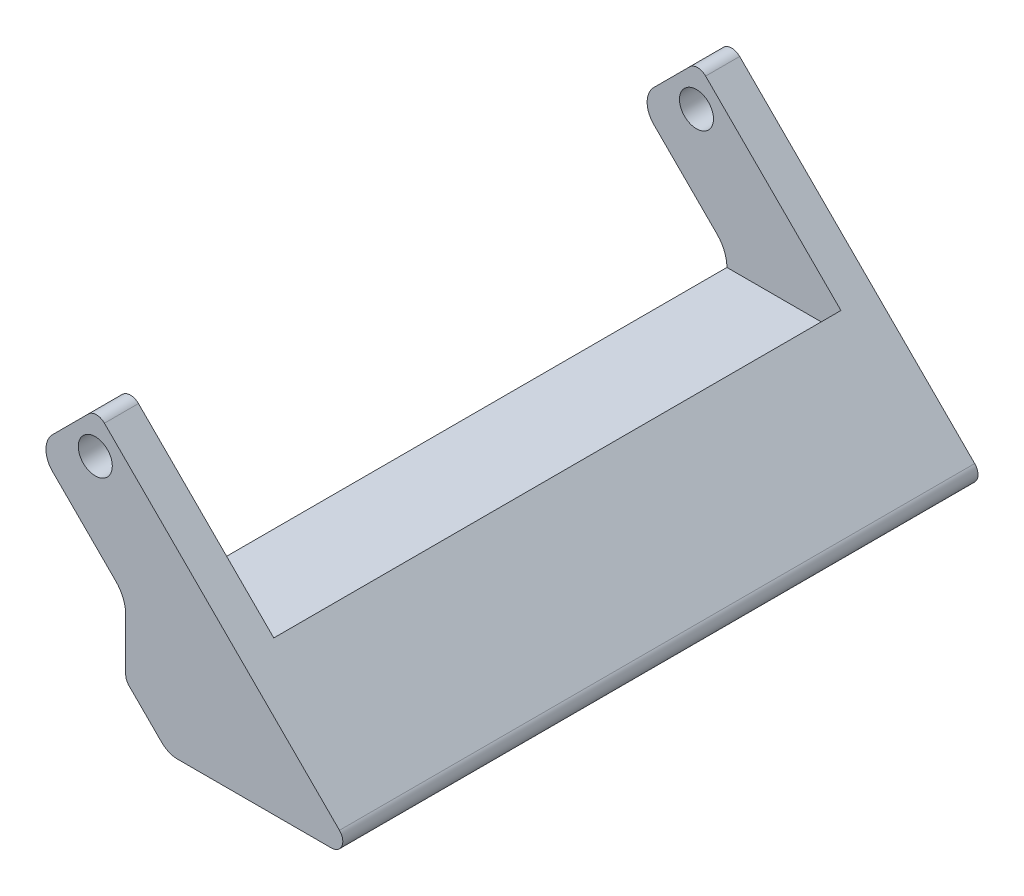
ISO-10303-21;
HEADER;
FILE_DESCRIPTION(('STEP AP214'),'2;1');
FILE_NAME('part.step','',(''),(''),'','','');
FILE_SCHEMA(('AUTOMOTIVE_DESIGN { 1 0 10303 214 1 1 1 1 }'));
ENDSEC;
DATA;
#1=APPLICATION_CONTEXT('core data for automotive mechanical design processes');
#2=APPLICATION_PROTOCOL_DEFINITION('international standard','automotive_design',2000,#1);
#3=PRODUCT_CONTEXT('',#1,'mechanical');
#4=PRODUCT('Part','Part','',(#3));
#5=PRODUCT_RELATED_PRODUCT_CATEGORY('part','',(#4));
#6=PRODUCT_DEFINITION_FORMATION('','',#4);
#7=PRODUCT_DEFINITION_CONTEXT('part definition',#1,'design');
#8=PRODUCT_DEFINITION('design','',#6,#7);
#9=PRODUCT_DEFINITION_SHAPE('','',#8);
#10=(LENGTH_UNIT() NAMED_UNIT(*) SI_UNIT(.MILLI.,.METRE.));
#11=(NAMED_UNIT(*) PLANE_ANGLE_UNIT() SI_UNIT($,.RADIAN.));
#12=(NAMED_UNIT(*) SI_UNIT($,.STERADIAN.) SOLID_ANGLE_UNIT());
#13=UNCERTAINTY_MEASURE_WITH_UNIT(LENGTH_MEASURE(1.E-05),#10,'distance_accuracy_value','');
#14=(GEOMETRIC_REPRESENTATION_CONTEXT(3) GLOBAL_UNCERTAINTY_ASSIGNED_CONTEXT((#13)) GLOBAL_UNIT_ASSIGNED_CONTEXT((#10,
#11,#12)) REPRESENTATION_CONTEXT('',''));
#15=CARTESIAN_POINT('',(0.,0.,0.));
#16=DIRECTION('',(0.,0.,1.));
#17=DIRECTION('',(1.,0.,0.));
#18=AXIS2_PLACEMENT_3D('',#15,#16,#17);
#19=CARTESIAN_POINT('',(0.,0.,3.));
#20=DIRECTION('',(0.,0.,1.));
#21=DIRECTION('',(1.,0.,0.));
#22=AXIS2_PLACEMENT_3D('',#19,#20,#21);
#23=PLANE('',#22);
#24=DIRECTION('',(1.,0.,0.));
#25=VECTOR('',#24,1.);
#26=CARTESIAN_POINT('',(0.,-10.7426406871192,3.));
#27=LINE('',#26,#25);
#28=CARTESIAN_POINT('',(2.68220240980189,-10.7426406871192,3.));
#29=VERTEX_POINT('',#28);
#30=CARTESIAN_POINT('',(10.9959109087866,-10.7426406871192,3.));
#31=VERTEX_POINT('',#30);
#32=EDGE_CURVE('E200',#29,#31,#27,.T.);
#33=ORIENTED_EDGE('',*,*,#32,.T.);
#34=DIRECTION('',(-0.707106781186549,-0.707106781186546,0.));
#35=VECTOR('',#34,1.);
#36=CARTESIAN_POINT('',(55.8310574860341,34.0925058901282,3.));
#37=LINE('',#36,#35);
#38=CARTESIAN_POINT('',(12.7360377002854,-9.00251389562044,3.));
#39=VERTEX_POINT('',#38);
#40=EDGE_CURVE('E191',#39,#31,#37,.T.);
#41=ORIENTED_EDGE('',*,*,#40,.F.);
#42=DIRECTION('',(0.707106781186546,-0.707106781186549,0.));
#43=VECTOR('',#42,1.);
#44=CARTESIAN_POINT('',(1.86676190233249,1.86676190233248,3.));
#45=LINE('',#44,#43);
#46=CARTESIAN_POINT('',(0.806101730552668,2.92742207411231,3.));
#47=VERTEX_POINT('',#46);
#48=EDGE_CURVE('E172',#47,#39,#45,.T.);
#49=ORIENTED_EDGE('',*,*,#48,.F.);
#50=CARTESIAN_POINT('',(0.0989949493661204,2.22031529292576,3.));
#51=DIRECTION('',(0.,0.,1.));
#52=DIRECTION('',(1.,0.,0.));
#53=AXIS2_PLACEMENT_3D('',#50,#51,#52);
#54=CIRCLE('',#53,1.);
#55=CARTESIAN_POINT('',(-0.608111831820427,2.92742207411231,3.));
#56=VERTEX_POINT('',#55);
#57=EDGE_CURVE('E183',#47,#56,#54,.T.);
#58=ORIENTED_EDGE('',*,*,#57,.T.);
#59=DIRECTION('',(-0.707106781186549,-0.707106781186547,0.));
#60=VECTOR('',#59,1.);
#61=CARTESIAN_POINT('',(-1.76776695296637,1.76776695296637,3.));
#62=LINE('',#61,#60);
#63=CARTESIAN_POINT('',(-3.76245218569227,-0.226918279759524,3.));
#64=VERTEX_POINT('',#63);
#65=EDGE_CURVE('E284',#56,#64,#62,.T.);
#66=ORIENTED_EDGE('',*,*,#65,.T.);
#67=CARTESIAN_POINT('',(-2.34823862331918,-1.64113184213262,3.));
#68=DIRECTION('',(0.,0.,1.));
#69=DIRECTION('',(1.,0.,0.));
#70=AXIS2_PLACEMENT_3D('',#67,#68,#69);
#71=CIRCLE('',#70,2.);
#72=CARTESIAN_POINT('',(-3.76245218569227,-3.05534540450571,3.));
#73=VERTEX_POINT('',#72);
#74=EDGE_CURVE('E286',#64,#73,#71,.T.);
#75=ORIENTED_EDGE('',*,*,#74,.T.);
#76=DIRECTION('',(0.707106781186546,-0.707106781186549,0.));
#77=VECTOR('',#76,1.);
#78=CARTESIAN_POINT('',(-3.408898795099,-3.40889879509899,3.));
#79=LINE('',#78,#77);
#80=CARTESIAN_POINT('',(1.80352275336153,-8.62132034355954,3.));
#81=VERTEX_POINT('',#80);
#82=EDGE_CURVE('E278',#73,#81,#79,.T.);
#83=ORIENTED_EDGE('',*,*,#82,.T.);
#84=CARTESIAN_POINT('',(-0.317797590198112,-10.7426406871192,3.));
#85=DIRECTION('',(0.,0.,1.));
#86=DIRECTION('',(1.,0.,0.));
#87=AXIS2_PLACEMENT_3D('',#84,#85,#86);
#88=CIRCLE('',#87,3.);
#89=EDGE_CURVE('E184',#81,#29,#88,.F.);
#90=ORIENTED_EDGE('',*,*,#89,.T.);
#91=EDGE_LOOP('',(#33,#41,#49,#58,#66,#75,#83,#90));
#92=FACE_BOUND('',#91,.T.);
#93=CARTESIAN_POINT('',(0.,0.,3.));
#94=DIRECTION('',(0.,0.,1.));
#95=DIRECTION('',(1.,0.,0.));
#96=AXIS2_PLACEMENT_3D('',#93,#94,#95);
#97=CIRCLE('',#96,1.5);
#98=CARTESIAN_POINT('',(1.5,0.,3.));
#99=VERTEX_POINT('',#98);
#100=EDGE_CURVE('E275',#99,#99,#97,.T.);
#101=ORIENTED_EDGE('',*,*,#100,.F.);
#102=EDGE_LOOP('',(#101));
#103=FACE_BOUND('',#102,.T.);
#104=ADVANCED_FACE('F35',(#92,#103),#23,.T.);
#105=CARTESIAN_POINT('',(-3.408898795099,-3.40889879509899,3.));
#106=DIRECTION('',(0.707106781186549,0.707106781186546,0.));
#107=DIRECTION('',(-0.707106781186546,0.707106781186549,0.));
#108=AXIS2_PLACEMENT_3D('',#105,#106,#107);
#109=PLANE('',#108);
#110=DIRECTION('',(0.707106781186546,-0.707106781186549,0.));
#111=VECTOR('',#110,1.);
#112=CARTESIAN_POINT('',(-3.408898795099,-3.40889879509899,0.));
#113=LINE('',#112,#111);
#114=CARTESIAN_POINT('',(-3.76245218569227,-3.05534540450571,0.));
#115=VERTEX_POINT('',#114);
#116=CARTESIAN_POINT('',(1.80352275336153,-8.62132034355954,0.));
#117=VERTEX_POINT('',#116);
#118=EDGE_CURVE('E291',#115,#117,#113,.T.);
#119=ORIENTED_EDGE('',*,*,#118,.T.);
#120=DIRECTION('',(0.,0.,-1.));
#121=VECTOR('',#120,1.);
#122=CARTESIAN_POINT('',(1.80352275336153,-8.62132034355954,3.));
#123=LINE('',#122,#121);
#124=EDGE_CURVE('E320',#81,#117,#123,.T.);
#125=ORIENTED_EDGE('',*,*,#124,.F.);
#126=ORIENTED_EDGE('',*,*,#82,.F.);
#127=DIRECTION('',(0.,0.,-1.));
#128=VECTOR('',#127,1.);
#129=CARTESIAN_POINT('',(-3.76245218569227,-3.05534540450571,3.));
#130=LINE('',#129,#128);
#131=EDGE_CURVE('E288',#73,#115,#130,.T.);
#132=ORIENTED_EDGE('',*,*,#131,.T.);
#133=EDGE_LOOP('',(#119,#125,#126,#132));
#134=FACE_BOUND('',#133,.T.);
#135=ADVANCED_FACE('F371',(#134),#109,.F.);
#136=CARTESIAN_POINT('',(-0.317797590198112,-10.7426406871192,3.));
#137=DIRECTION('',(0.,0.,-1.));
#138=DIRECTION('',(-1.,0.,0.));
#139=AXIS2_PLACEMENT_3D('',#136,#137,#138);
#140=CYLINDRICAL_SURFACE('',#139,3.);
#141=CARTESIAN_POINT('',(-0.317797590198112,-10.7426406871192,0.));
#142=DIRECTION('',(0.,0.,1.));
#143=DIRECTION('',(1.,0.,0.));
#144=AXIS2_PLACEMENT_3D('',#141,#142,#143);
#145=CIRCLE('',#144,3.);
#146=CARTESIAN_POINT('',(2.68220240980189,-10.7426406871192,0.));
#147=VERTEX_POINT('',#146);
#148=EDGE_CURVE('E294',#117,#147,#145,.F.);
#149=ORIENTED_EDGE('',*,*,#148,.T.);
#150=DIRECTION('',(0.,0.,-1.));
#151=VECTOR('',#150,1.);
#152=CARTESIAN_POINT('',(2.68220240980189,-10.7426406871192,3.));
#153=LINE('',#152,#151);
#154=EDGE_CURVE('E317',#29,#147,#153,.T.);
#155=ORIENTED_EDGE('',*,*,#154,.F.);
#156=ORIENTED_EDGE('',*,*,#89,.F.);
#157=ORIENTED_EDGE('',*,*,#124,.T.);
#158=EDGE_LOOP('',(#149,#155,#156,#157));
#159=FACE_BOUND('',#158,.T.);
#160=ADVANCED_FACE('F373',(#159),#140,.F.);
#161=CARTESIAN_POINT('',(2.68220240980189,0.,3.));
#162=DIRECTION('',(1.,0.,0.));
#163=DIRECTION('',(0.,0.,-1.));
#164=AXIS2_PLACEMENT_3D('',#161,#162,#163);
#165=PLANE('',#164);
#166=DIRECTION('',(0.,-1.,0.));
#167=VECTOR('',#166,1.);
#168=CARTESIAN_POINT('',(2.68220240980189,0.,0.));
#169=LINE('',#168,#167);
#170=CARTESIAN_POINT('',(2.68220240980189,-15.3284271247461,0.));
#171=VERTEX_POINT('',#170);
#172=EDGE_CURVE('E296',#147,#171,#169,.T.);
#173=ORIENTED_EDGE('',*,*,#172,.T.);
#174=DIRECTION('',(0.,0.,-1.));
#175=VECTOR('',#174,1.);
#176=CARTESIAN_POINT('',(2.68220240980189,-15.3284271247461,3.));
#177=LINE('',#176,#175);
#178=CARTESIAN_POINT('',(2.68220240980189,-15.3284271247461,56.));
#179=VERTEX_POINT('',#178);
#180=EDGE_CURVE('E341',#171,#179,#177,.F.);
#181=ORIENTED_EDGE('',*,*,#180,.T.);
#182=DIRECTION('',(0.,-1.,0.));
#183=VECTOR('',#182,1.);
#184=CARTESIAN_POINT('',(2.68220240980189,0.,56.));
#185=LINE('',#184,#183);
#186=CARTESIAN_POINT('',(2.68220240980189,-10.7426406871192,56.));
#187=VERTEX_POINT('',#186);
#188=EDGE_CURVE('E238',#187,#179,#185,.T.);
#189=ORIENTED_EDGE('',*,*,#188,.F.);
#190=DIRECTION('',(0.,0.,1.));
#191=VECTOR('',#190,1.);
#192=CARTESIAN_POINT('',(2.68220240980189,-10.7426406871192,53.));
#193=LINE('',#192,#191);
#194=CARTESIAN_POINT('',(2.68220240980189,-10.7426406871192,53.));
#195=VERTEX_POINT('',#194);
#196=EDGE_CURVE('E263',#195,#187,#193,.T.);
#197=ORIENTED_EDGE('',*,*,#196,.F.);
#198=DIRECTION('',(0.,0.,-1.));
#199=VECTOR('',#198,1.);
#200=CARTESIAN_POINT('',(2.68220240980189,-10.7426406871192,28.));
#201=LINE('',#200,#199);
#202=EDGE_CURVE('E272',#195,#29,#201,.T.);
#203=ORIENTED_EDGE('',*,*,#202,.T.);
#204=ORIENTED_EDGE('',*,*,#154,.T.);
#205=EDGE_LOOP('',(#173,#181,#189,#197,#203,#204));
#206=FACE_BOUND('',#205,.T.);
#207=ADVANCED_FACE('F377',(#206),#165,.F.);
#208=CARTESIAN_POINT('',(0.,-19.5,3.));
#209=DIRECTION('',(0.,1.,0.));
#210=DIRECTION('',(-1.,0.,0.));
#211=AXIS2_PLACEMENT_3D('',#208,#209,#210);
#212=PLANE('',#211);
#213=DIRECTION('',(1.,0.,0.));
#214=VECTOR('',#213,1.);
#215=CARTESIAN_POINT('',(0.,-19.5,0.));
#216=LINE('',#215,#214);
#217=CARTESIAN_POINT('',(7.26798884742889,-19.5,0.));
#218=VERTEX_POINT('',#217);
#219=CARTESIAN_POINT('',(20.8193102422918,-19.5,0.));
#220=VERTEX_POINT('',#219);
#221=EDGE_CURVE('E299',#218,#220,#216,.T.);
#222=ORIENTED_EDGE('',*,*,#221,.T.);
#223=DIRECTION('',(0.,0.,-1.));
#224=VECTOR('',#223,1.);
#225=CARTESIAN_POINT('',(20.8193102422918,-19.5,56.));
#226=LINE('',#225,#224);
#227=CARTESIAN_POINT('',(20.8193102422918,-19.5,56.));
#228=VERTEX_POINT('',#227);
#229=EDGE_CURVE('E43',#220,#228,#226,.F.);
#230=ORIENTED_EDGE('',*,*,#229,.T.);
#231=DIRECTION('',(1.,0.,0.));
#232=VECTOR('',#231,1.);
#233=CARTESIAN_POINT('',(0.,-19.5,56.));
#234=LINE('',#233,#232);
#235=CARTESIAN_POINT('',(7.26798884742889,-19.5,56.));
#236=VERTEX_POINT('',#235);
#237=EDGE_CURVE('E241',#236,#228,#234,.T.);
#238=ORIENTED_EDGE('',*,*,#237,.F.);
#239=DIRECTION('',(0.,0.,-1.));
#240=VECTOR('',#239,1.);
#241=CARTESIAN_POINT('',(7.26798884742889,-19.5,3.));
#242=LINE('',#241,#240);
#243=EDGE_CURVE('E325',#236,#218,#242,.T.);
#244=ORIENTED_EDGE('',*,*,#243,.T.);
#245=EDGE_LOOP('',(#222,#230,#238,#244));
#246=FACE_BOUND('',#245,.T.);
#247=ADVANCED_FACE('F430',(#246),#212,.F.);
#248=CARTESIAN_POINT('',(1.86676190233249,1.86676190233248,3.));
#249=DIRECTION('',(0.707106781186549,0.707106781186546,0.));
#250=DIRECTION('',(-0.707106781186546,0.707106781186549,0.));
#251=AXIS2_PLACEMENT_3D('',#248,#249,#250);
#252=PLANE('',#251);
#253=DIRECTION('',(0.707106781186546,-0.707106781186549,0.));
#254=VECTOR('',#253,1.);
#255=CARTESIAN_POINT('',(1.86676190233249,1.86676190233248,56.));
#256=LINE('',#255,#254);
#257=CARTESIAN_POINT('',(0.806101730552668,2.92742207411231,56.));
#258=VERTEX_POINT('',#257);
#259=CARTESIAN_POINT('',(21.5264170234783,-17.7928932188135,56.));
#260=VERTEX_POINT('',#259);
#261=EDGE_CURVE('E243',#258,#260,#256,.T.);
#262=ORIENTED_EDGE('',*,*,#261,.T.);
#263=DIRECTION('',(0.,0.,-1.));
#264=VECTOR('',#263,1.);
#265=CARTESIAN_POINT('',(21.5264170234783,-17.7928932188135,0.));
#266=LINE('',#265,#264);
#267=CARTESIAN_POINT('',(21.5264170234783,-17.7928932188135,0.));
#268=VERTEX_POINT('',#267);
#269=EDGE_CURVE('E345',#260,#268,#266,.T.);
#270=ORIENTED_EDGE('',*,*,#269,.T.);
#271=DIRECTION('',(0.707106781186546,-0.707106781186549,0.));
#272=VECTOR('',#271,1.);
#273=CARTESIAN_POINT('',(1.86676190233249,1.86676190233248,0.));
#274=LINE('',#273,#272);
#275=CARTESIAN_POINT('',(0.806101730552668,2.92742207411231,0.));
#276=VERTEX_POINT('',#275);
#277=EDGE_CURVE('E301',#276,#268,#274,.T.);
#278=ORIENTED_EDGE('',*,*,#277,.F.);
#279=DIRECTION('',(0.,0.,-1.));
#280=VECTOR('',#279,1.);
#281=CARTESIAN_POINT('',(0.806101730552668,2.92742207411231,3.));
#282=LINE('',#281,#280);
#283=EDGE_CURVE('E179',#47,#276,#282,.T.);
#284=ORIENTED_EDGE('',*,*,#283,.F.);
#285=ORIENTED_EDGE('',*,*,#48,.T.);
#286=DIRECTION('',(0.,0.,1.));
#287=VECTOR('',#286,1.);
#288=CARTESIAN_POINT('',(12.7360377002854,-9.00251389562045,53.));
#289=LINE('',#288,#287);
#290=CARTESIAN_POINT('',(12.7360377002854,-9.00251389562044,53.));
#291=VERTEX_POINT('',#290);
#292=EDGE_CURVE('E177',#39,#291,#289,.T.);
#293=ORIENTED_EDGE('',*,*,#292,.T.);
#294=DIRECTION('',(0.707106781186546,-0.707106781186549,0.));
#295=VECTOR('',#294,1.);
#296=CARTESIAN_POINT('',(1.86676190233249,1.86676190233248,53.));
#297=LINE('',#296,#295);
#298=CARTESIAN_POINT('',(0.806101730552668,2.92742207411231,53.));
#299=VERTEX_POINT('',#298);
#300=EDGE_CURVE('E218',#299,#291,#297,.T.);
#301=ORIENTED_EDGE('',*,*,#300,.F.);
#302=DIRECTION('',(0.,0.,1.));
#303=VECTOR('',#302,1.);
#304=CARTESIAN_POINT('',(0.806101730552668,2.92742207411231,53.));
#305=LINE('',#304,#303);
#306=EDGE_CURVE('E260',#299,#258,#305,.T.);
#307=ORIENTED_EDGE('',*,*,#306,.T.);
#308=EDGE_LOOP('',(#262,#270,#278,#284,#285,#293,#301,#307));
#309=FACE_BOUND('',#308,.T.);
#310=ADVANCED_FACE('F175',(#309),#252,.T.);
#311=CARTESIAN_POINT('',(0.0989949493661204,2.22031529292576,3.));
#312=DIRECTION('',(0.,0.,-1.));
#313=DIRECTION('',(-1.,0.,0.));
#314=AXIS2_PLACEMENT_3D('',#311,#312,#313);
#315=CYLINDRICAL_SURFACE('',#314,1.);
#316=CARTESIAN_POINT('',(0.0989949493661204,2.22031529292576,0.));
#317=DIRECTION('',(0.,0.,1.));
#318=DIRECTION('',(1.,0.,0.));
#319=AXIS2_PLACEMENT_3D('',#316,#317,#318);
#320=CIRCLE('',#319,1.);
#321=CARTESIAN_POINT('',(-0.608111831820427,2.92742207411231,0.));
#322=VERTEX_POINT('',#321);
#323=EDGE_CURVE('E303',#276,#322,#320,.T.);
#324=ORIENTED_EDGE('',*,*,#323,.T.);
#325=DIRECTION('',(0.,0.,-1.));
#326=VECTOR('',#325,1.);
#327=CARTESIAN_POINT('',(-0.608111831820427,2.92742207411231,3.));
#328=LINE('',#327,#326);
#329=EDGE_CURVE('E313',#56,#322,#328,.T.);
#330=ORIENTED_EDGE('',*,*,#329,.F.);
#331=ORIENTED_EDGE('',*,*,#57,.F.);
#332=ORIENTED_EDGE('',*,*,#283,.T.);
#333=EDGE_LOOP('',(#324,#330,#331,#332));
#334=FACE_BOUND('',#333,.T.);
#335=ADVANCED_FACE('F358',(#334),#315,.T.);
#336=CARTESIAN_POINT('',(-1.76776695296637,1.76776695296637,3.));
#337=DIRECTION('',(0.707106781186546,-0.707106781186548,0.));
#338=DIRECTION('',(0.707106781186549,0.707106781186547,0.));
#339=AXIS2_PLACEMENT_3D('',#336,#337,#338);
#340=PLANE('',#339);
#341=DIRECTION('',(-0.707106781186549,-0.707106781186547,0.));
#342=VECTOR('',#341,1.);
#343=CARTESIAN_POINT('',(-1.76776695296637,1.76776695296637,0.));
#344=LINE('',#343,#342);
#345=CARTESIAN_POINT('',(-3.76245218569227,-0.226918279759524,0.));
#346=VERTEX_POINT('',#345);
#347=EDGE_CURVE('E305',#322,#346,#344,.T.);
#348=ORIENTED_EDGE('',*,*,#347,.T.);
#349=DIRECTION('',(0.,0.,-1.));
#350=VECTOR('',#349,1.);
#351=CARTESIAN_POINT('',(-3.76245218569227,-0.226918279759524,3.));
#352=LINE('',#351,#350);
#353=EDGE_CURVE('E310',#64,#346,#352,.T.);
#354=ORIENTED_EDGE('',*,*,#353,.F.);
#355=ORIENTED_EDGE('',*,*,#65,.F.);
#356=ORIENTED_EDGE('',*,*,#329,.T.);
#357=EDGE_LOOP('',(#348,#354,#355,#356));
#358=FACE_BOUND('',#357,.T.);
#359=ADVANCED_FACE('F361',(#358),#340,.F.);
#360=CARTESIAN_POINT('',(0.,0.,3.));
#361=DIRECTION('',(0.,0.,-1.));
#362=DIRECTION('',(-1.,0.,0.));
#363=AXIS2_PLACEMENT_3D('',#360,#361,#362);
#364=CYLINDRICAL_SURFACE('',#363,1.5);
#365=ORIENTED_EDGE('',*,*,#100,.T.);
#366=EDGE_LOOP('',(#365));
#367=FACE_BOUND('',#366,.T.);
#368=CARTESIAN_POINT('',(0.,0.,0.));
#369=DIRECTION('',(0.,0.,1.));
#370=DIRECTION('',(1.,0.,0.));
#371=AXIS2_PLACEMENT_3D('',#368,#369,#370);
#372=CIRCLE('',#371,1.5);
#373=CARTESIAN_POINT('',(1.5,0.,0.));
#374=VERTEX_POINT('',#373);
#375=EDGE_CURVE('E274',#374,#374,#372,.T.);
#376=ORIENTED_EDGE('',*,*,#375,.F.);
#377=EDGE_LOOP('',(#376));
#378=FACE_BOUND('',#377,.T.);
#379=ADVANCED_FACE('F423',(#367,#378),#364,.F.);
#380=CARTESIAN_POINT('',(-2.34823862331918,-1.64113184213262,3.));
#381=DIRECTION('',(0.,0.,-1.));
#382=DIRECTION('',(-1.,0.,0.));
#383=AXIS2_PLACEMENT_3D('',#380,#381,#382);
#384=CYLINDRICAL_SURFACE('',#383,2.);
#385=CARTESIAN_POINT('',(-2.34823862331918,-1.64113184213262,0.));
#386=DIRECTION('',(0.,0.,1.));
#387=DIRECTION('',(1.,0.,0.));
#388=AXIS2_PLACEMENT_3D('',#385,#386,#387);
#389=CIRCLE('',#388,2.);
#390=EDGE_CURVE('E279',#346,#115,#389,.T.);
#391=ORIENTED_EDGE('',*,*,#390,.T.);
#392=ORIENTED_EDGE('',*,*,#131,.F.);
#393=ORIENTED_EDGE('',*,*,#74,.F.);
#394=ORIENTED_EDGE('',*,*,#353,.T.);
#395=EDGE_LOOP('',(#391,#392,#393,#394));
#396=FACE_BOUND('',#395,.T.);
#397=ADVANCED_FACE('F368',(#396),#384,.T.);
#398=CARTESIAN_POINT('',(0.,0.,0.));
#399=DIRECTION('',(0.,0.,1.));
#400=DIRECTION('',(1.,0.,0.));
#401=AXIS2_PLACEMENT_3D('',#398,#399,#400);
#402=PLANE('',#401);
#403=ORIENTED_EDGE('',*,*,#375,.T.);
#404=EDGE_LOOP('',(#403));
#405=FACE_BOUND('',#404,.T.);
#406=ORIENTED_EDGE('',*,*,#277,.T.);
#407=CARTESIAN_POINT('',(20.8193102422918,-18.5,0.));
#408=DIRECTION('',(0.,0.,1.));
#409=DIRECTION('',(1.,0.,0.));
#410=AXIS2_PLACEMENT_3D('',#407,#408,#409);
#411=CIRCLE('',#410,1.);
#412=EDGE_CURVE('E57',#268,#220,#411,.F.);
#413=ORIENTED_EDGE('',*,*,#412,.T.);
#414=ORIENTED_EDGE('',*,*,#221,.F.);
#415=CARTESIAN_POINT('',(7.26798884742889,-17.5,0.));
#416=DIRECTION('',(0.,0.,1.));
#417=DIRECTION('',(1.,0.,0.));
#418=AXIS2_PLACEMENT_3D('',#415,#416,#417);
#419=CIRCLE('',#418,2.);
#420=CARTESIAN_POINT('',(5.85377528505579,-18.9142135623731,0.));
#421=VERTEX_POINT('',#420);
#422=EDGE_CURVE('E328',#218,#421,#419,.F.);
#423=ORIENTED_EDGE('',*,*,#422,.T.);
#424=DIRECTION('',(0.707106781186546,-0.707106781186548,0.));
#425=VECTOR('',#424,1.);
#426=CARTESIAN_POINT('',(2.68220240980189,-15.7426406871192,0.));
#427=LINE('',#426,#425);
#428=CARTESIAN_POINT('',(2.97509562861534,-16.0355339059326,0.));
#429=VERTEX_POINT('',#428);
#430=EDGE_CURVE('E194',#429,#421,#427,.T.);
#431=ORIENTED_EDGE('',*,*,#430,.F.);
#432=CARTESIAN_POINT('',(3.68220240980189,-15.3284271247461,0.));
#433=DIRECTION('',(0.,0.,1.));
#434=DIRECTION('',(1.,0.,0.));
#435=AXIS2_PLACEMENT_3D('',#432,#433,#434);
#436=CIRCLE('',#435,1.);
#437=EDGE_CURVE('E339',#429,#171,#436,.F.);
#438=ORIENTED_EDGE('',*,*,#437,.T.);
#439=ORIENTED_EDGE('',*,*,#172,.F.);
#440=ORIENTED_EDGE('',*,*,#148,.F.);
#441=ORIENTED_EDGE('',*,*,#118,.F.);
#442=ORIENTED_EDGE('',*,*,#390,.F.);
#443=ORIENTED_EDGE('',*,*,#347,.F.);
#444=ORIENTED_EDGE('',*,*,#323,.F.);
#445=EDGE_LOOP('',(#406,#413,#414,#423,#431,#438,#439,#440,#441,#442,#443,#444));
#446=FACE_BOUND('',#445,.T.);
#447=ADVANCED_FACE('F353',(#405,#446),#402,.F.);
#448=CARTESIAN_POINT('',(0.,-10.7426406871192,28.));
#449=DIRECTION('',(0.,1.,0.));
#450=DIRECTION('',(0.,0.,1.));
#451=AXIS2_PLACEMENT_3D('',#448,#449,#450);
#452=PLANE('',#451);
#453=ORIENTED_EDGE('',*,*,#32,.F.);
#454=ORIENTED_EDGE('',*,*,#202,.F.);
#455=DIRECTION('',(1.,0.,0.));
#456=VECTOR('',#455,1.);
#457=CARTESIAN_POINT('',(0.,-10.7426406871192,53.));
#458=LINE('',#457,#456);
#459=CARTESIAN_POINT('',(10.9959109087866,-10.7426406871192,53.));
#460=VERTEX_POINT('',#459);
#461=EDGE_CURVE('E205',#195,#460,#458,.T.);
#462=ORIENTED_EDGE('',*,*,#461,.T.);
#463=DIRECTION('',(0.,0.,-1.));
#464=VECTOR('',#463,1.);
#465=CARTESIAN_POINT('',(10.9959109087866,-10.7426406871192,28.));
#466=LINE('',#465,#464);
#467=EDGE_CURVE('E270',#460,#31,#466,.T.);
#468=ORIENTED_EDGE('',*,*,#467,.T.);
#469=EDGE_LOOP('',(#453,#454,#462,#468));
#470=FACE_BOUND('',#469,.T.);
#471=ADVANCED_FACE('F402',(#470),#452,.T.);
#472=CARTESIAN_POINT('',(0.,0.,53.));
#473=DIRECTION('',(0.,0.,-1.));
#474=DIRECTION('',(1.,0.,0.));
#475=AXIS2_PLACEMENT_3D('',#472,#473,#474);
#476=PLANE('',#475);
#477=DIRECTION('',(-0.707106781186549,-0.707106781186546,0.));
#478=VECTOR('',#477,1.);
#479=CARTESIAN_POINT('',(55.8310574860341,34.0925058901282,53.));
#480=LINE('',#479,#478);
#481=EDGE_CURVE('E193',#291,#460,#480,.T.);
#482=ORIENTED_EDGE('',*,*,#481,.T.);
#483=ORIENTED_EDGE('',*,*,#461,.F.);
#484=CARTESIAN_POINT('',(-0.317797590198112,-10.7426406871192,53.));
#485=DIRECTION('',(0.,0.,1.));
#486=DIRECTION('',(1.,0.,0.));
#487=AXIS2_PLACEMENT_3D('',#484,#485,#486);
#488=CIRCLE('',#487,3.);
#489=CARTESIAN_POINT('',(1.80352275336153,-8.62132034355954,53.));
#490=VERTEX_POINT('',#489);
#491=EDGE_CURVE('E215',#490,#195,#488,.F.);
#492=ORIENTED_EDGE('',*,*,#491,.F.);
#493=DIRECTION('',(0.707106781186546,-0.707106781186549,0.));
#494=VECTOR('',#493,1.);
#495=CARTESIAN_POINT('',(-3.408898795099,-3.40889879509899,53.));
#496=LINE('',#495,#494);
#497=CARTESIAN_POINT('',(-3.76245218569227,-3.05534540450571,53.));
#498=VERTEX_POINT('',#497);
#499=EDGE_CURVE('E211',#498,#490,#496,.T.);
#500=ORIENTED_EDGE('',*,*,#499,.F.);
#501=CARTESIAN_POINT('',(-2.34823862331918,-1.64113184213262,53.));
#502=DIRECTION('',(0.,0.,1.));
#503=DIRECTION('',(1.,0.,0.));
#504=AXIS2_PLACEMENT_3D('',#501,#502,#503);
#505=CIRCLE('',#504,2.);
#506=CARTESIAN_POINT('',(-3.76245218569227,-0.226918279759524,53.));
#507=VERTEX_POINT('',#506);
#508=EDGE_CURVE('E226',#507,#498,#505,.T.);
#509=ORIENTED_EDGE('',*,*,#508,.F.);
#510=DIRECTION('',(-0.707106781186549,-0.707106781186547,0.));
#511=VECTOR('',#510,1.);
#512=CARTESIAN_POINT('',(-1.76776695296637,1.76776695296637,53.));
#513=LINE('',#512,#511);
#514=CARTESIAN_POINT('',(-0.608111831820427,2.92742207411231,53.));
#515=VERTEX_POINT('',#514);
#516=EDGE_CURVE('E223',#515,#507,#513,.T.);
#517=ORIENTED_EDGE('',*,*,#516,.F.);
#518=CARTESIAN_POINT('',(0.0989949493661204,2.22031529292576,53.));
#519=DIRECTION('',(0.,0.,1.));
#520=DIRECTION('',(1.,0.,0.));
#521=AXIS2_PLACEMENT_3D('',#518,#519,#520);
#522=CIRCLE('',#521,1.);
#523=EDGE_CURVE('E220',#299,#515,#522,.T.);
#524=ORIENTED_EDGE('',*,*,#523,.F.);
#525=ORIENTED_EDGE('',*,*,#300,.T.);
#526=EDGE_LOOP('',(#482,#483,#492,#500,#509,#517,#524,#525));
#527=FACE_BOUND('',#526,.T.);
#528=CARTESIAN_POINT('',(0.,0.,53.));
#529=DIRECTION('',(0.,0.,1.));
#530=DIRECTION('',(1.,0.,0.));
#531=AXIS2_PLACEMENT_3D('',#528,#529,#530);
#532=CIRCLE('',#531,1.5);
#533=CARTESIAN_POINT('',(1.5,0.,53.));
#534=VERTEX_POINT('',#533);
#535=EDGE_CURVE('E208',#534,#534,#532,.T.);
#536=ORIENTED_EDGE('',*,*,#535,.T.);
#537=EDGE_LOOP('',(#536));
#538=FACE_BOUND('',#537,.T.);
#539=ADVANCED_FACE('F398',(#527,#538),#476,.T.);
#540=CARTESIAN_POINT('',(-3.408898795099,-3.40889879509899,53.));
#541=DIRECTION('',(0.707106781186549,0.707106781186546,0.));
#542=DIRECTION('',(-0.707106781186546,0.707106781186549,0.));
#543=AXIS2_PLACEMENT_3D('',#540,#541,#542);
#544=PLANE('',#543);
#545=DIRECTION('',(0.707106781186546,-0.707106781186549,0.));
#546=VECTOR('',#545,1.);
#547=CARTESIAN_POINT('',(-3.408898795099,-3.40889879509899,56.));
#548=LINE('',#547,#546);
#549=CARTESIAN_POINT('',(-3.76245218569227,-3.05534540450571,56.));
#550=VERTEX_POINT('',#549);
#551=CARTESIAN_POINT('',(1.80352275336153,-8.62132034355954,56.));
#552=VERTEX_POINT('',#551);
#553=EDGE_CURVE('E232',#550,#552,#548,.T.);
#554=ORIENTED_EDGE('',*,*,#553,.F.);
#555=DIRECTION('',(0.,0.,1.));
#556=VECTOR('',#555,1.);
#557=CARTESIAN_POINT('',(-3.76245218569227,-3.05534540450571,53.));
#558=LINE('',#557,#556);
#559=EDGE_CURVE('E229',#498,#550,#558,.T.);
#560=ORIENTED_EDGE('',*,*,#559,.F.);
#561=ORIENTED_EDGE('',*,*,#499,.T.);
#562=DIRECTION('',(0.,0.,1.));
#563=VECTOR('',#562,1.);
#564=CARTESIAN_POINT('',(1.80352275336153,-8.62132034355954,53.));
#565=LINE('',#564,#563);
#566=EDGE_CURVE('E266',#490,#552,#565,.T.);
#567=ORIENTED_EDGE('',*,*,#566,.T.);
#568=EDGE_LOOP('',(#554,#560,#561,#567));
#569=FACE_BOUND('',#568,.T.);
#570=ADVANCED_FACE('F409',(#569),#544,.F.);
#571=CARTESIAN_POINT('',(-0.317797590198112,-10.7426406871192,53.));
#572=DIRECTION('',(0.,0.,1.));
#573=DIRECTION('',(-1.,0.,0.));
#574=AXIS2_PLACEMENT_3D('',#571,#572,#573);
#575=CYLINDRICAL_SURFACE('',#574,3.);
#576=CARTESIAN_POINT('',(-0.317797590198112,-10.7426406871192,56.));
#577=DIRECTION('',(0.,0.,1.));
#578=DIRECTION('',(1.,0.,0.));
#579=AXIS2_PLACEMENT_3D('',#576,#577,#578);
#580=CIRCLE('',#579,3.);
#581=EDGE_CURVE('E235',#552,#187,#580,.F.);
#582=ORIENTED_EDGE('',*,*,#581,.F.);
#583=ORIENTED_EDGE('',*,*,#566,.F.);
#584=ORIENTED_EDGE('',*,*,#491,.T.);
#585=ORIENTED_EDGE('',*,*,#196,.T.);
#586=EDGE_LOOP('',(#582,#583,#584,#585));
#587=FACE_BOUND('',#586,.T.);
#588=ADVANCED_FACE('F394',(#587),#575,.F.);
#589=CARTESIAN_POINT('',(0.0989949493661204,2.22031529292576,53.));
#590=DIRECTION('',(0.,0.,1.));
#591=DIRECTION('',(-1.,0.,0.));
#592=AXIS2_PLACEMENT_3D('',#589,#590,#591);
#593=CYLINDRICAL_SURFACE('',#592,1.);
#594=CARTESIAN_POINT('',(0.0989949493661204,2.22031529292576,56.));
#595=DIRECTION('',(0.,0.,1.));
#596=DIRECTION('',(1.,0.,0.));
#597=AXIS2_PLACEMENT_3D('',#594,#595,#596);
#598=CIRCLE('',#597,1.);
#599=CARTESIAN_POINT('',(-0.608111831820427,2.92742207411231,56.));
#600=VERTEX_POINT('',#599);
#601=EDGE_CURVE('E245',#258,#600,#598,.T.);
#602=ORIENTED_EDGE('',*,*,#601,.F.);
#603=ORIENTED_EDGE('',*,*,#306,.F.);
#604=ORIENTED_EDGE('',*,*,#523,.T.);
#605=DIRECTION('',(0.,0.,1.));
#606=VECTOR('',#605,1.);
#607=CARTESIAN_POINT('',(-0.608111831820427,2.92742207411231,53.));
#608=LINE('',#607,#606);
#609=EDGE_CURVE('E257',#515,#600,#608,.T.);
#610=ORIENTED_EDGE('',*,*,#609,.T.);
#611=EDGE_LOOP('',(#602,#603,#604,#610));
#612=FACE_BOUND('',#611,.T.);
#613=ADVANCED_FACE('F465',(#612),#593,.T.);
#614=CARTESIAN_POINT('',(-1.76776695296637,1.76776695296637,53.));
#615=DIRECTION('',(0.707106781186546,-0.707106781186548,0.));
#616=DIRECTION('',(0.707106781186549,0.707106781186547,0.));
#617=AXIS2_PLACEMENT_3D('',#614,#615,#616);
#618=PLANE('',#617);
#619=DIRECTION('',(-0.707106781186549,-0.707106781186547,0.));
#620=VECTOR('',#619,1.);
#621=CARTESIAN_POINT('',(-1.76776695296637,1.76776695296637,56.));
#622=LINE('',#621,#620);
#623=CARTESIAN_POINT('',(-3.76245218569227,-0.226918279759524,56.));
#624=VERTEX_POINT('',#623);
#625=EDGE_CURVE('E248',#600,#624,#622,.T.);
#626=ORIENTED_EDGE('',*,*,#625,.F.);
#627=ORIENTED_EDGE('',*,*,#609,.F.);
#628=ORIENTED_EDGE('',*,*,#516,.T.);
#629=DIRECTION('',(0.,0.,1.));
#630=VECTOR('',#629,1.);
#631=CARTESIAN_POINT('',(-3.76245218569227,-0.226918279759524,53.));
#632=LINE('',#631,#630);
#633=EDGE_CURVE('E254',#507,#624,#632,.T.);
#634=ORIENTED_EDGE('',*,*,#633,.T.);
#635=EDGE_LOOP('',(#626,#627,#628,#634));
#636=FACE_BOUND('',#635,.T.);
#637=ADVANCED_FACE('F462',(#636),#618,.F.);
#638=CARTESIAN_POINT('',(0.,0.,53.));
#639=DIRECTION('',(0.,0.,1.));
#640=DIRECTION('',(-1.,0.,0.));
#641=AXIS2_PLACEMENT_3D('',#638,#639,#640);
#642=CYLINDRICAL_SURFACE('',#641,1.5);
#643=ORIENTED_EDGE('',*,*,#535,.F.);
#644=EDGE_LOOP('',(#643));
#645=FACE_BOUND('',#644,.T.);
#646=CARTESIAN_POINT('',(0.,0.,56.));
#647=DIRECTION('',(0.,0.,1.));
#648=DIRECTION('',(1.,0.,0.));
#649=AXIS2_PLACEMENT_3D('',#646,#647,#648);
#650=CIRCLE('',#649,1.5);
#651=CARTESIAN_POINT('',(1.5,0.,56.));
#652=VERTEX_POINT('',#651);
#653=EDGE_CURVE('E207',#652,#652,#650,.T.);
#654=ORIENTED_EDGE('',*,*,#653,.T.);
#655=EDGE_LOOP('',(#654));
#656=FACE_BOUND('',#655,.T.);
#657=ADVANCED_FACE('F460',(#645,#656),#642,.F.);
#658=CARTESIAN_POINT('',(-2.34823862331918,-1.64113184213262,53.));
#659=DIRECTION('',(0.,0.,1.));
#660=DIRECTION('',(-1.,0.,0.));
#661=AXIS2_PLACEMENT_3D('',#658,#659,#660);
#662=CYLINDRICAL_SURFACE('',#661,2.);
#663=CARTESIAN_POINT('',(-2.34823862331918,-1.64113184213262,56.));
#664=DIRECTION('',(0.,0.,1.));
#665=DIRECTION('',(1.,0.,0.));
#666=AXIS2_PLACEMENT_3D('',#663,#664,#665);
#667=CIRCLE('',#666,2.);
#668=EDGE_CURVE('E212',#624,#550,#667,.T.);
#669=ORIENTED_EDGE('',*,*,#668,.F.);
#670=ORIENTED_EDGE('',*,*,#633,.F.);
#671=ORIENTED_EDGE('',*,*,#508,.T.);
#672=ORIENTED_EDGE('',*,*,#559,.T.);
#673=EDGE_LOOP('',(#669,#670,#671,#672));
#674=FACE_BOUND('',#673,.T.);
#675=ADVANCED_FACE('F456',(#674),#662,.T.);
#676=CARTESIAN_POINT('',(0.,0.,56.));
#677=DIRECTION('',(0.,0.,-1.));
#678=DIRECTION('',(1.,0.,0.));
#679=AXIS2_PLACEMENT_3D('',#676,#677,#678);
#680=PLANE('',#679);
#681=ORIENTED_EDGE('',*,*,#653,.F.);
#682=EDGE_LOOP('',(#681));
#683=FACE_BOUND('',#682,.T.);
#684=ORIENTED_EDGE('',*,*,#237,.T.);
#685=CARTESIAN_POINT('',(20.8193102422918,-18.5,56.));
#686=DIRECTION('',(0.,0.,-1.));
#687=DIRECTION('',(-1.,0.,0.));
#688=AXIS2_PLACEMENT_3D('',#685,#686,#687);
#689=CIRCLE('',#688,1.);
#690=EDGE_CURVE('E11',#228,#260,#689,.F.);
#691=ORIENTED_EDGE('',*,*,#690,.T.);
#692=ORIENTED_EDGE('',*,*,#261,.F.);
#693=ORIENTED_EDGE('',*,*,#601,.T.);
#694=ORIENTED_EDGE('',*,*,#625,.T.);
#695=ORIENTED_EDGE('',*,*,#668,.T.);
#696=ORIENTED_EDGE('',*,*,#553,.T.);
#697=ORIENTED_EDGE('',*,*,#581,.T.);
#698=ORIENTED_EDGE('',*,*,#188,.T.);
#699=CARTESIAN_POINT('',(3.68220240980189,-15.3284271247461,56.));
#700=DIRECTION('',(0.,0.,-1.));
#701=DIRECTION('',(-1.,0.,0.));
#702=AXIS2_PLACEMENT_3D('',#699,#700,#701);
#703=CIRCLE('',#702,1.);
#704=CARTESIAN_POINT('',(2.97509562861534,-16.0355339059326,56.));
#705=VERTEX_POINT('',#704);
#706=EDGE_CURVE('E343',#179,#705,#703,.F.);
#707=ORIENTED_EDGE('',*,*,#706,.T.);
#708=DIRECTION('',(0.707106781186547,-0.707106781186549,0.));
#709=VECTOR('',#708,1.);
#710=CARTESIAN_POINT('',(-6.53021913865864,-6.53021913865863,56.));
#711=LINE('',#710,#709);
#712=CARTESIAN_POINT('',(5.85377528505579,-18.9142135623731,56.));
#713=VERTEX_POINT('',#712);
#714=EDGE_CURVE('E323',#705,#713,#711,.T.);
#715=ORIENTED_EDGE('',*,*,#714,.T.);
#716=CARTESIAN_POINT('',(7.26798884742889,-17.5,56.));
#717=DIRECTION('',(0.,0.,-1.));
#718=DIRECTION('',(-1.,0.,0.));
#719=AXIS2_PLACEMENT_3D('',#716,#717,#718);
#720=CIRCLE('',#719,2.);
#721=EDGE_CURVE('E334',#713,#236,#720,.F.);
#722=ORIENTED_EDGE('',*,*,#721,.T.);
#723=EDGE_LOOP('',(#684,#691,#692,#693,#694,#695,#696,#697,#698,#707,#715,#722));
#724=FACE_BOUND('',#723,.T.);
#725=ADVANCED_FACE('F391',(#683,#724),#680,.F.);
#726=CARTESIAN_POINT('',(-6.53021913865864,-6.53021913865862,0.));
#727=DIRECTION('',(0.707106781186549,0.707106781186547,0.));
#728=DIRECTION('',(-0.707106781186547,0.707106781186549,0.));
#729=AXIS2_PLACEMENT_3D('',#726,#727,#728);
#730=PLANE('',#729);
#731=ORIENTED_EDGE('',*,*,#714,.F.);
#732=DIRECTION('',(0.,0.,-1.));
#733=VECTOR('',#732,1.);
#734=CARTESIAN_POINT('',(2.97509562861534,-16.0355339059326,0.));
#735=LINE('',#734,#733);
#736=EDGE_CURVE('E336',#705,#429,#735,.T.);
#737=ORIENTED_EDGE('',*,*,#736,.T.);
#738=ORIENTED_EDGE('',*,*,#430,.T.);
#739=DIRECTION('',(0.,0.,-1.));
#740=VECTOR('',#739,1.);
#741=CARTESIAN_POINT('',(5.85377528505579,-18.9142135623731,0.));
#742=LINE('',#741,#740);
#743=EDGE_CURVE('E331',#421,#713,#742,.F.);
#744=ORIENTED_EDGE('',*,*,#743,.T.);
#745=EDGE_LOOP('',(#731,#737,#738,#744));
#746=FACE_BOUND('',#745,.T.);
#747=ADVANCED_FACE('F387',(#746),#730,.F.);
#748=CARTESIAN_POINT('',(7.26798884742889,-17.5,3.));
#749=DIRECTION('',(0.,0.,-1.));
#750=DIRECTION('',(-1.,0.,0.));
#751=AXIS2_PLACEMENT_3D('',#748,#749,#750);
#752=CYLINDRICAL_SURFACE('',#751,2.);
#753=ORIENTED_EDGE('',*,*,#721,.F.);
#754=ORIENTED_EDGE('',*,*,#743,.F.);
#755=ORIENTED_EDGE('',*,*,#422,.F.);
#756=ORIENTED_EDGE('',*,*,#243,.F.);
#757=EDGE_LOOP('',(#753,#754,#755,#756));
#758=FACE_BOUND('',#757,.T.);
#759=ADVANCED_FACE('F440',(#758),#752,.T.);
#760=CARTESIAN_POINT('',(3.68220240980189,-15.3284271247461,0.));
#761=DIRECTION('',(0.,0.,-1.));
#762=DIRECTION('',(-1.,0.,0.));
#763=AXIS2_PLACEMENT_3D('',#760,#761,#762);
#764=CYLINDRICAL_SURFACE('',#763,1.);
#765=ORIENTED_EDGE('',*,*,#706,.F.);
#766=ORIENTED_EDGE('',*,*,#180,.F.);
#767=ORIENTED_EDGE('',*,*,#437,.F.);
#768=ORIENTED_EDGE('',*,*,#736,.F.);
#769=EDGE_LOOP('',(#765,#766,#767,#768));
#770=FACE_BOUND('',#769,.T.);
#771=ADVANCED_FACE('F384',(#770),#764,.T.);
#772=CARTESIAN_POINT('',(55.8310574860341,34.0925058901282,53.));
#773=DIRECTION('',(0.707106781186546,-0.707106781186549,0.));
#774=DIRECTION('',(0.707106781186549,0.707106781186546,0.));
#775=AXIS2_PLACEMENT_3D('',#772,#773,#774);
#776=PLANE('',#775);
#777=ORIENTED_EDGE('',*,*,#292,.F.);
#778=ORIENTED_EDGE('',*,*,#40,.T.);
#779=ORIENTED_EDGE('',*,*,#467,.F.);
#780=ORIENTED_EDGE('',*,*,#481,.F.);
#781=EDGE_LOOP('',(#777,#778,#779,#780));
#782=FACE_BOUND('',#781,.T.);
#783=ADVANCED_FACE('F189',(#782),#776,.F.);
#784=CARTESIAN_POINT('',(20.8193102422918,-18.5,3.));
#785=DIRECTION('',(0.,0.,1.));
#786=DIRECTION('',(1.,0.,0.));
#787=AXIS2_PLACEMENT_3D('',#784,#785,#786);
#788=CYLINDRICAL_SURFACE('',#787,1.);
#789=ORIENTED_EDGE('',*,*,#690,.F.);
#790=ORIENTED_EDGE('',*,*,#229,.F.);
#791=ORIENTED_EDGE('',*,*,#412,.F.);
#792=ORIENTED_EDGE('',*,*,#269,.F.);
#793=EDGE_LOOP('',(#789,#790,#791,#792));
#794=FACE_BOUND('',#793,.T.);
#795=ADVANCED_FACE('F37',(#794),#788,.T.);
#796=CLOSED_SHELL('',(#104,#135,#160,#207,#247,#310,#335,#359,#379,#397,#447,#471,#539,#570,
#588,#613,#637,#657,#675,#725,#747,#759,#771,#783,#795));
#797=MANIFOLD_SOLID_BREP('B2',#796);
#798=ADVANCED_BREP_SHAPE_REPRESENTATION('',(#18,#797),#14);
#799=SHAPE_DEFINITION_REPRESENTATION(#9,#798);
ENDSEC;
END-ISO-10303-21;
